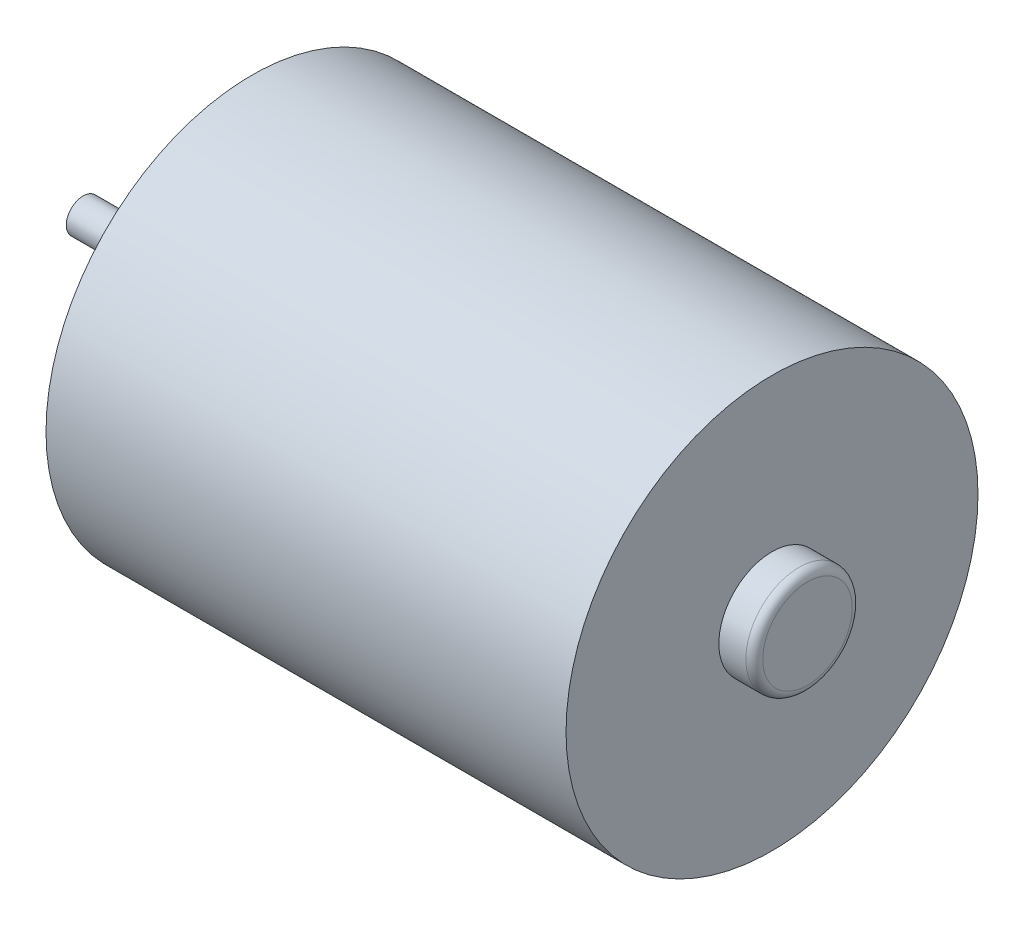
ISO-10303-21;
HEADER;
FILE_DESCRIPTION(('STEP AP214'),'2;1');
FILE_NAME('part.step','',(''),(''),'','','');
FILE_SCHEMA(('AUTOMOTIVE_DESIGN { 1 0 10303 214 1 1 1 1 }'));
ENDSEC;
DATA;
#1=APPLICATION_CONTEXT('core data for automotive mechanical design processes');
#2=APPLICATION_PROTOCOL_DEFINITION('international standard','automotive_design',2000,#1);
#3=PRODUCT_CONTEXT('',#1,'mechanical');
#4=PRODUCT('Part','Part','',(#3));
#5=PRODUCT_RELATED_PRODUCT_CATEGORY('part','',(#4));
#6=PRODUCT_DEFINITION_FORMATION('','',#4);
#7=PRODUCT_DEFINITION_CONTEXT('part definition',#1,'design');
#8=PRODUCT_DEFINITION('design','',#6,#7);
#9=PRODUCT_DEFINITION_SHAPE('','',#8);
#10=(LENGTH_UNIT() NAMED_UNIT(*) SI_UNIT(.MILLI.,.METRE.));
#11=(NAMED_UNIT(*) PLANE_ANGLE_UNIT() SI_UNIT($,.RADIAN.));
#12=(NAMED_UNIT(*) SI_UNIT($,.STERADIAN.) SOLID_ANGLE_UNIT());
#13=UNCERTAINTY_MEASURE_WITH_UNIT(LENGTH_MEASURE(1.E-05),#10,'distance_accuracy_value','');
#14=(GEOMETRIC_REPRESENTATION_CONTEXT(3) GLOBAL_UNCERTAINTY_ASSIGNED_CONTEXT((#13)) GLOBAL_UNIT_ASSIGNED_CONTEXT((#10,
#11,#12)) REPRESENTATION_CONTEXT('',''));
#15=CARTESIAN_POINT('',(0.,0.,0.));
#16=DIRECTION('',(0.,0.,1.));
#17=DIRECTION('',(1.,0.,0.));
#18=AXIS2_PLACEMENT_3D('',#15,#16,#17);
#19=CARTESIAN_POINT('',(30.8,0.,0.));
#20=DIRECTION('',(-1.,0.,0.));
#21=DIRECTION('',(0.,0.,1.));
#22=AXIS2_PLACEMENT_3D('',#19,#20,#21);
#23=CYLINDRICAL_SURFACE('',#22,12.2);
#24=CARTESIAN_POINT('',(30.8,0.,0.));
#25=DIRECTION('',(1.,0.,0.));
#26=DIRECTION('',(0.,0.,-1.));
#27=AXIS2_PLACEMENT_3D('',#24,#25,#26);
#28=CIRCLE('',#27,12.2);
#29=CARTESIAN_POINT('',(30.8,0.,12.2));
#30=VERTEX_POINT('',#29);
#31=EDGE_CURVE('E53',#30,#30,#28,.T.);
#32=CARTESIAN_POINT('',(0.,0.,0.));
#33=DIRECTION('',(1.,0.,0.));
#34=DIRECTION('',(0.,0.,-1.));
#35=AXIS2_PLACEMENT_3D('',#32,#33,#34);
#36=CIRCLE('',#35,12.2);
#37=CARTESIAN_POINT('',(0.,0.,12.2));
#38=VERTEX_POINT('',#37);
#39=EDGE_CURVE('E56',#38,#38,#36,.T.);
#40=CARTESIAN_POINT('',(30.8,0.,12.2));
#41=CARTESIAN_POINT('',(30.4791666666667,0.,12.2));
#42=CARTESIAN_POINT('',(30.1583333333333,0.,12.2));
#43=CARTESIAN_POINT('',(29.5166666666667,0.,12.2));
#44=CARTESIAN_POINT('',(29.1958333333333,0.,12.2));
#45=CARTESIAN_POINT('',(28.5541666666667,0.,12.2));
#46=CARTESIAN_POINT('',(28.2333333333333,0.,12.2));
#47=CARTESIAN_POINT('',(27.5916666666667,0.,12.2));
#48=CARTESIAN_POINT('',(27.2708333333333,0.,12.2));
#49=CARTESIAN_POINT('',(26.6291666666667,0.,12.2));
#50=CARTESIAN_POINT('',(26.3083333333333,0.,12.2));
#51=CARTESIAN_POINT('',(25.6666666666667,0.,12.2));
#52=CARTESIAN_POINT('',(25.3458333333333,0.,12.2));
#53=CARTESIAN_POINT('',(24.7041666666667,0.,12.2));
#54=CARTESIAN_POINT('',(24.3833333333333,0.,12.2));
#55=CARTESIAN_POINT('',(23.7416666666667,0.,12.2));
#56=CARTESIAN_POINT('',(23.4208333333333,0.,12.2));
#57=CARTESIAN_POINT('',(22.7791666666667,0.,12.2));
#58=CARTESIAN_POINT('',(22.4583333333333,0.,12.2));
#59=CARTESIAN_POINT('',(21.8166666666667,0.,12.2));
#60=CARTESIAN_POINT('',(21.4958333333333,0.,12.2));
#61=CARTESIAN_POINT('',(20.8541666666667,0.,12.2));
#62=CARTESIAN_POINT('',(20.5333333333333,0.,12.2));
#63=CARTESIAN_POINT('',(19.8916666666667,0.,12.2));
#64=CARTESIAN_POINT('',(19.5708333333333,0.,12.2));
#65=CARTESIAN_POINT('',(18.9291666666667,0.,12.2));
#66=CARTESIAN_POINT('',(18.6083333333333,0.,12.2));
#67=CARTESIAN_POINT('',(17.9666666666667,0.,12.2));
#68=CARTESIAN_POINT('',(17.6458333333333,0.,12.2));
#69=CARTESIAN_POINT('',(17.0041666666667,0.,12.2));
#70=CARTESIAN_POINT('',(16.6833333333333,0.,12.2));
#71=CARTESIAN_POINT('',(16.0416666666667,0.,12.2));
#72=CARTESIAN_POINT('',(15.7208333333333,0.,12.2));
#73=CARTESIAN_POINT('',(15.0791666666667,0.,12.2));
#74=CARTESIAN_POINT('',(14.7583333333333,0.,12.2));
#75=CARTESIAN_POINT('',(14.1166666666667,0.,12.2));
#76=CARTESIAN_POINT('',(13.7958333333333,0.,12.2));
#77=CARTESIAN_POINT('',(13.1541666666667,0.,12.2));
#78=CARTESIAN_POINT('',(12.8333333333333,0.,12.2));
#79=CARTESIAN_POINT('',(12.1916666666667,0.,12.2));
#80=CARTESIAN_POINT('',(11.8708333333333,0.,12.2));
#81=CARTESIAN_POINT('',(11.2291666666667,0.,12.2));
#82=CARTESIAN_POINT('',(10.9083333333333,0.,12.2));
#83=CARTESIAN_POINT('',(10.2666666666667,0.,12.2));
#84=CARTESIAN_POINT('',(9.94583333333333,0.,12.2));
#85=CARTESIAN_POINT('',(9.30416666666667,0.,12.2));
#86=CARTESIAN_POINT('',(8.98333333333333,0.,12.2));
#87=CARTESIAN_POINT('',(8.34166666666667,0.,12.2));
#88=CARTESIAN_POINT('',(8.02083333333333,0.,12.2));
#89=CARTESIAN_POINT('',(7.37916666666666,0.,12.2));
#90=CARTESIAN_POINT('',(7.05833333333333,0.,12.2));
#91=CARTESIAN_POINT('',(6.41666666666666,0.,12.2));
#92=CARTESIAN_POINT('',(6.09583333333333,0.,12.2));
#93=CARTESIAN_POINT('',(5.45416666666667,0.,12.2));
#94=CARTESIAN_POINT('',(5.13333333333333,0.,12.2));
#95=CARTESIAN_POINT('',(4.49166666666666,0.,12.2));
#96=CARTESIAN_POINT('',(4.17083333333333,0.,12.2));
#97=CARTESIAN_POINT('',(3.52916666666666,0.,12.2));
#98=CARTESIAN_POINT('',(3.20833333333333,0.,12.2));
#99=CARTESIAN_POINT('',(2.56666666666666,0.,12.2));
#100=CARTESIAN_POINT('',(2.24583333333333,0.,12.2));
#101=CARTESIAN_POINT('',(1.60416666666666,0.,12.2));
#102=CARTESIAN_POINT('',(1.28333333333333,0.,12.2));
#103=CARTESIAN_POINT('',(0.641666666666664,0.,12.2));
#104=CARTESIAN_POINT('',(0.32083333333333,0.,12.2));
#105=CARTESIAN_POINT('',(0.,0.,12.2));
#106=B_SPLINE_CURVE_WITH_KNOTS('',3,(#40,#41,#42,#43,#44,#45,#46,#47,#48,#49,#50,#51,#52,#53,
#54,#55,#56,#57,#58,#59,#60,#61,#62,#63,#64,#65,#66,#67,#68,#69,#70,#71,#72,#73,#74,#75,#76,#77,
#78,#79,#80,#81,#82,#83,#84,#85,#86,#87,#88,#89,#90,#91,#92,#93,#94,#95,#96,#97,#98,#99,#100,
#101,#102,#103,#104,#105),.UNSPECIFIED.,.F.,.F.,(4,2,2,2,2,2,2,2,2,2,2,2,2,2,2,2,2,2,2,2,2,2,2,
2,2,2,2,2,2,2,2,2,4),(0.,0.962500000000002,1.925,2.8875,3.85,4.8125,5.775,6.7375,7.7,8.6625,
9.625,10.5875,11.55,12.5125,13.475,14.4375,15.4,16.3625,17.325,18.2875,19.25,20.2125,21.175,
22.1375,23.1,24.0625,25.025,25.9875,26.95,27.9125,28.875,29.8375,30.8),.UNSPECIFIED.);
#107=EDGE_CURVE('BSEAM32',#30,#38,#106,.T.);
#108=ORIENTED_EDGE('',*,*,#31,.F.);
#109=ORIENTED_EDGE('',*,*,#39,.T.);
#110=ORIENTED_EDGE('',*,*,#107,.T.);
#111=ORIENTED_EDGE('',*,*,#107,.F.);
#112=EDGE_LOOP('',(#108,#110,#109,#111));
#113=FACE_BOUND('',#112,.T.);
#114=ADVANCED_FACE('F32',(#113),#23,.T.);
#115=CARTESIAN_POINT('',(30.8,0.,0.));
#116=DIRECTION('',(1.,0.,0.));
#117=DIRECTION('',(0.,0.,-1.));
#118=AXIS2_PLACEMENT_3D('',#115,#116,#117);
#119=PLANE('',#118);
#120=CARTESIAN_POINT('',(30.8,0.,0.));
#121=DIRECTION('',(1.,0.,0.));
#122=DIRECTION('',(0.,0.,-1.));
#123=AXIS2_PLACEMENT_3D('',#120,#121,#122);
#124=CIRCLE('',#123,3.15);
#125=CARTESIAN_POINT('',(30.8,0.,-3.15));
#126=VERTEX_POINT('',#125);
#127=EDGE_CURVE('E50',#126,#126,#124,.T.);
#128=ORIENTED_EDGE('',*,*,#127,.F.);
#129=EDGE_LOOP('',(#128));
#130=FACE_BOUND('',#129,.T.);
#131=ORIENTED_EDGE('',*,*,#31,.T.);
#132=EDGE_LOOP('',(#131));
#133=FACE_BOUND('',#132,.T.);
#134=ADVANCED_FACE('F78',(#130,#133),#119,.T.);
#135=CARTESIAN_POINT('',(0.,0.,0.));
#136=DIRECTION('',(1.,0.,0.));
#137=DIRECTION('',(0.,0.,-1.));
#138=AXIS2_PLACEMENT_3D('',#135,#136,#137);
#139=PLANE('',#138);
#140=CARTESIAN_POINT('',(0.,0.,8.5));
#141=DIRECTION('',(-1.,0.,0.));
#142=DIRECTION('',(0.,0.,1.));
#143=AXIS2_PLACEMENT_3D('',#140,#141,#142);
#144=CIRCLE('',#143,1.1);
#145=CARTESIAN_POINT('',(0.,0.,9.6));
#146=VERTEX_POINT('',#145);
#147=EDGE_CURVE('E127',#146,#146,#144,.T.);
#148=ORIENTED_EDGE('',*,*,#147,.F.);
#149=EDGE_LOOP('',(#148));
#150=FACE_BOUND('',#149,.T.);
#151=CARTESIAN_POINT('',(0.,0.,-8.5));
#152=DIRECTION('',(-1.,0.,0.));
#153=DIRECTION('',(0.,0.,1.));
#154=AXIS2_PLACEMENT_3D('',#151,#152,#153);
#155=CIRCLE('',#154,1.1);
#156=CARTESIAN_POINT('',(0.,0.,-7.4));
#157=VERTEX_POINT('',#156);
#158=EDGE_CURVE('E136',#157,#157,#155,.T.);
#159=ORIENTED_EDGE('',*,*,#158,.F.);
#160=EDGE_LOOP('',(#159));
#161=FACE_BOUND('',#160,.T.);
#162=CARTESIAN_POINT('',(0.,0.,0.));
#163=DIRECTION('',(-1.,0.,0.));
#164=DIRECTION('',(0.,0.,1.));
#165=AXIS2_PLACEMENT_3D('',#162,#163,#164);
#166=CIRCLE('',#165,3.225);
#167=CARTESIAN_POINT('',(0.,0.,3.225));
#168=VERTEX_POINT('',#167);
#169=EDGE_CURVE('E10',#168,#168,#166,.T.);
#170=ORIENTED_EDGE('',*,*,#169,.F.);
#171=EDGE_LOOP('',(#170));
#172=FACE_BOUND('',#171,.T.);
#173=ORIENTED_EDGE('',*,*,#39,.F.);
#174=EDGE_LOOP('',(#173));
#175=FACE_BOUND('',#174,.T.);
#176=ADVANCED_FACE('F83',(#150,#161,#172,#175),#139,.F.);
#177=CARTESIAN_POINT('',(32.9,0.,0.));
#178=DIRECTION('',(-1.,0.,0.));
#179=DIRECTION('',(0.,0.,1.));
#180=AXIS2_PLACEMENT_3D('',#177,#178,#179);
#181=CYLINDRICAL_SURFACE('',#180,3.15);
#182=CARTESIAN_POINT('',(32.4,0.,0.));
#183=DIRECTION('',(1.,0.,0.));
#184=DIRECTION('',(0.,0.,-1.));
#185=AXIS2_PLACEMENT_3D('',#182,#183,#184);
#186=CIRCLE('',#185,3.15);
#187=CARTESIAN_POINT('',(32.4,0.,-3.15));
#188=VERTEX_POINT('',#187);
#189=EDGE_CURVE('E40',#188,#188,#186,.F.);
#190=ORIENTED_EDGE('',*,*,#189,.T.);
#191=EDGE_LOOP('',(#190));
#192=FACE_BOUND('',#191,.T.);
#193=ORIENTED_EDGE('',*,*,#127,.T.);
#194=EDGE_LOOP('',(#193));
#195=FACE_BOUND('',#194,.T.);
#196=ADVANCED_FACE('F74',(#192,#195),#181,.T.);
#197=CARTESIAN_POINT('',(32.9,0.,0.));
#198=DIRECTION('',(1.,0.,0.));
#199=DIRECTION('',(0.,0.,-1.));
#200=AXIS2_PLACEMENT_3D('',#197,#198,#199);
#201=PLANE('',#200);
#202=CARTESIAN_POINT('',(32.9,0.,0.));
#203=DIRECTION('',(1.,0.,0.));
#204=DIRECTION('',(0.,0.,-1.));
#205=AXIS2_PLACEMENT_3D('',#202,#203,#204);
#206=CIRCLE('',#205,2.65);
#207=CARTESIAN_POINT('',(32.9,0.,-2.65));
#208=VERTEX_POINT('',#207);
#209=EDGE_CURVE('E45',#208,#208,#206,.T.);
#210=ORIENTED_EDGE('',*,*,#209,.T.);
#211=EDGE_LOOP('',(#210));
#212=FACE_BOUND('',#211,.T.);
#213=ADVANCED_FACE('F62',(#212),#201,.T.);
#214=CARTESIAN_POINT('',(32.4,0.,0.));
#215=DIRECTION('',(1.,0.,0.));
#216=DIRECTION('',(0.,0.,-1.));
#217=AXIS2_PLACEMENT_3D('',#214,#215,#216);
#218=TOROIDAL_SURFACE('',#217,2.65,0.5);
#219=ORIENTED_EDGE('',*,*,#189,.F.);
#220=EDGE_LOOP('',(#219));
#221=FACE_BOUND('',#220,.T.);
#222=ORIENTED_EDGE('',*,*,#209,.F.);
#223=EDGE_LOOP('',(#222));
#224=FACE_BOUND('',#223,.T.);
#225=ADVANCED_FACE('F34',(#221,#224),#218,.T.);
#226=CARTESIAN_POINT('',(-1.7,0.,0.));
#227=DIRECTION('',(1.,0.,0.));
#228=DIRECTION('',(0.,0.,-1.));
#229=AXIS2_PLACEMENT_3D('',#226,#227,#228);
#230=CYLINDRICAL_SURFACE('',#229,3.225);
#231=CARTESIAN_POINT('',(-1.7,0.,0.));
#232=DIRECTION('',(-1.,0.,0.));
#233=DIRECTION('',(0.,0.,1.));
#234=AXIS2_PLACEMENT_3D('',#231,#232,#233);
#235=CIRCLE('',#234,3.225);
#236=CARTESIAN_POINT('',(-1.7,0.,3.225));
#237=VERTEX_POINT('',#236);
#238=EDGE_CURVE('E48',#237,#237,#235,.T.);
#239=ORIENTED_EDGE('',*,*,#238,.F.);
#240=EDGE_LOOP('',(#239));
#241=FACE_BOUND('',#240,.T.);
#242=ORIENTED_EDGE('',*,*,#169,.T.);
#243=EDGE_LOOP('',(#242));
#244=FACE_BOUND('',#243,.T.);
#245=ADVANCED_FACE('F65',(#241,#244),#230,.T.);
#246=CARTESIAN_POINT('',(-1.7,0.,0.));
#247=DIRECTION('',(-1.,0.,0.));
#248=DIRECTION('',(0.,0.,1.));
#249=AXIS2_PLACEMENT_3D('',#246,#247,#248);
#250=PLANE('',#249);
#251=CARTESIAN_POINT('',(-1.7,0.,0.));
#252=DIRECTION('',(-1.,0.,0.));
#253=DIRECTION('',(0.,0.,1.));
#254=AXIS2_PLACEMENT_3D('',#251,#252,#253);
#255=CIRCLE('',#254,1.);
#256=CARTESIAN_POINT('',(-1.7,0.,1.));
#257=VERTEX_POINT('',#256);
#258=EDGE_CURVE('E36',#257,#257,#255,.F.);
#259=ORIENTED_EDGE('',*,*,#258,.T.);
#260=EDGE_LOOP('',(#259));
#261=FACE_BOUND('',#260,.T.);
#262=ORIENTED_EDGE('',*,*,#238,.T.);
#263=EDGE_LOOP('',(#262));
#264=FACE_BOUND('',#263,.T.);
#265=ADVANCED_FACE('F71',(#261,#264),#250,.T.);
#266=CARTESIAN_POINT('',(-10.,0.,0.));
#267=DIRECTION('',(1.,0.,0.));
#268=DIRECTION('',(0.,0.,-1.));
#269=AXIS2_PLACEMENT_3D('',#266,#267,#268);
#270=CYLINDRICAL_SURFACE('',#269,1.);
#271=ORIENTED_EDGE('',*,*,#258,.F.);
#272=EDGE_LOOP('',(#271));
#273=FACE_BOUND('',#272,.T.);
#274=CARTESIAN_POINT('',(-10.,0.,0.));
#275=DIRECTION('',(-1.,0.,0.));
#276=DIRECTION('',(0.,0.,1.));
#277=AXIS2_PLACEMENT_3D('',#274,#275,#276);
#278=CIRCLE('',#277,1.);
#279=CARTESIAN_POINT('',(-10.,0.,1.));
#280=VERTEX_POINT('',#279);
#281=EDGE_CURVE('E126',#280,#280,#278,.T.);
#282=ORIENTED_EDGE('',*,*,#281,.F.);
#283=EDGE_LOOP('',(#282));
#284=FACE_BOUND('',#283,.T.);
#285=ADVANCED_FACE('F97',(#273,#284),#270,.T.);
#286=CARTESIAN_POINT('',(-10.,0.,0.));
#287=DIRECTION('',(-1.,0.,0.));
#288=DIRECTION('',(0.,0.,1.));
#289=AXIS2_PLACEMENT_3D('',#286,#287,#288);
#290=PLANE('',#289);
#291=ORIENTED_EDGE('',*,*,#281,.T.);
#292=EDGE_LOOP('',(#291));
#293=FACE_BOUND('',#292,.T.);
#294=ADVANCED_FACE('F101',(#293),#290,.T.);
#295=CARTESIAN_POINT('',(3.,0.,-8.5));
#296=DIRECTION('',(-1.,0.,0.));
#297=DIRECTION('',(0.,0.,1.));
#298=AXIS2_PLACEMENT_3D('',#295,#296,#297);
#299=CYLINDRICAL_SURFACE('',#298,1.1);
#300=CARTESIAN_POINT('',(3.,0.,-8.5));
#301=DIRECTION('',(-1.,0.,0.));
#302=DIRECTION('',(0.,0.,1.));
#303=AXIS2_PLACEMENT_3D('',#300,#301,#302);
#304=CIRCLE('',#303,1.1);
#305=CARTESIAN_POINT('',(3.,0.,-7.4));
#306=VERTEX_POINT('',#305);
#307=EDGE_CURVE('E131',#306,#306,#304,.T.);
#308=ORIENTED_EDGE('',*,*,#307,.F.);
#309=EDGE_LOOP('',(#308));
#310=FACE_BOUND('',#309,.T.);
#311=ORIENTED_EDGE('',*,*,#158,.T.);
#312=EDGE_LOOP('',(#311));
#313=FACE_BOUND('',#312,.T.);
#314=ADVANCED_FACE('F105',(#310,#313),#299,.F.);
#315=CARTESIAN_POINT('',(3.,0.,-8.5));
#316=DIRECTION('',(-1.,0.,0.));
#317=DIRECTION('',(0.,0.,1.));
#318=AXIS2_PLACEMENT_3D('',#315,#316,#317);
#319=PLANE('',#318);
#320=ORIENTED_EDGE('',*,*,#307,.T.);
#321=EDGE_LOOP('',(#320));
#322=FACE_BOUND('',#321,.T.);
#323=ADVANCED_FACE('F109',(#322),#319,.T.);
#324=CARTESIAN_POINT('',(3.,0.,8.5));
#325=DIRECTION('',(-1.,0.,0.));
#326=DIRECTION('',(0.,0.,1.));
#327=AXIS2_PLACEMENT_3D('',#324,#325,#326);
#328=CYLINDRICAL_SURFACE('',#327,1.1);
#329=CARTESIAN_POINT('',(3.,0.,8.5));
#330=DIRECTION('',(-1.,0.,0.));
#331=DIRECTION('',(0.,0.,1.));
#332=AXIS2_PLACEMENT_3D('',#329,#330,#331);
#333=CIRCLE('',#332,1.1);
#334=CARTESIAN_POINT('',(3.,0.,9.6));
#335=VERTEX_POINT('',#334);
#336=EDGE_CURVE('E125',#335,#335,#333,.T.);
#337=ORIENTED_EDGE('',*,*,#336,.F.);
#338=EDGE_LOOP('',(#337));
#339=FACE_BOUND('',#338,.T.);
#340=ORIENTED_EDGE('',*,*,#147,.T.);
#341=EDGE_LOOP('',(#340));
#342=FACE_BOUND('',#341,.T.);
#343=ADVANCED_FACE('F113',(#339,#342),#328,.F.);
#344=CARTESIAN_POINT('',(3.,0.,8.5));
#345=DIRECTION('',(-1.,0.,0.));
#346=DIRECTION('',(0.,0.,1.));
#347=AXIS2_PLACEMENT_3D('',#344,#345,#346);
#348=PLANE('',#347);
#349=ORIENTED_EDGE('',*,*,#336,.T.);
#350=EDGE_LOOP('',(#349));
#351=FACE_BOUND('',#350,.T.);
#352=ADVANCED_FACE('F117',(#351),#348,.T.);
#353=CLOSED_SHELL('',(#114,#134,#176,#196,#213,#225,#245,#265,#285,#294,#314,#323,#343,#352));
#354=MANIFOLD_SOLID_BREP('B2',#353);
#355=ADVANCED_BREP_SHAPE_REPRESENTATION('',(#18,#354),#14);
#356=SHAPE_DEFINITION_REPRESENTATION(#9,#355);
ENDSEC;
END-ISO-10303-21;
